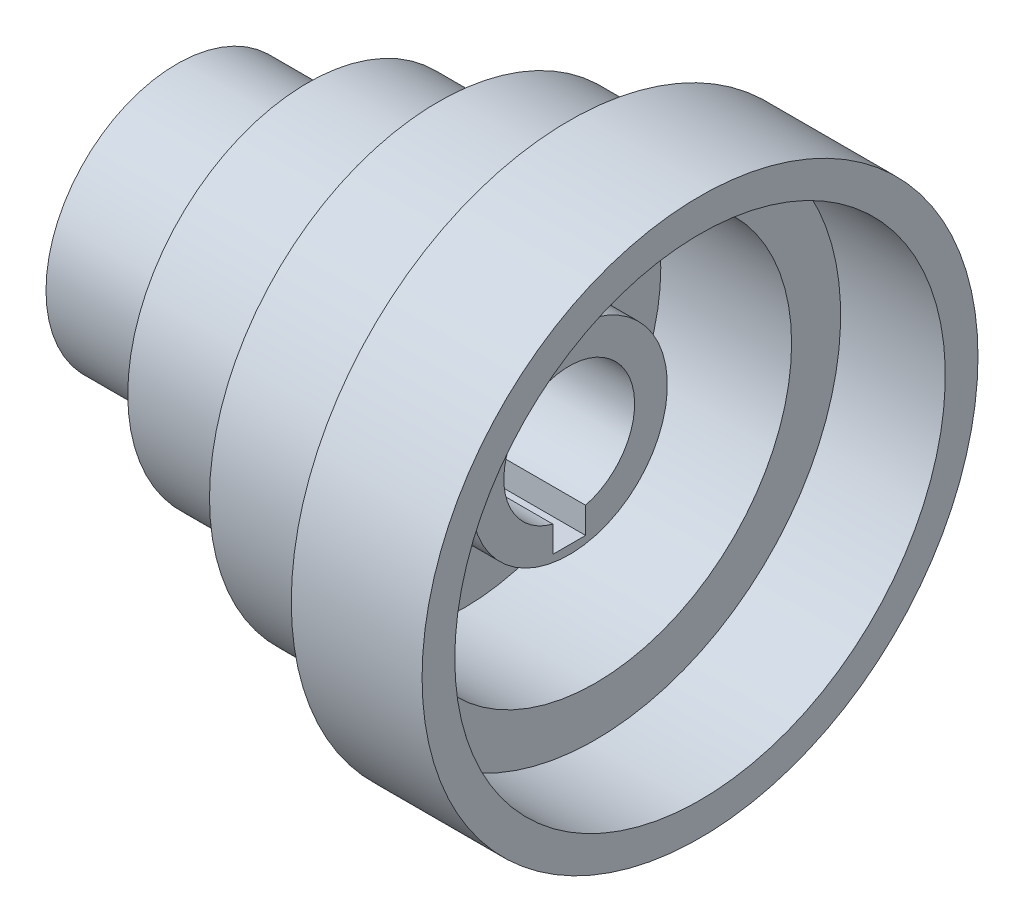
ISO-10303-21;
HEADER;
FILE_DESCRIPTION(('STEP AP214'),'2;1');
FILE_NAME('part.step','',(''),(''),'','','');
FILE_SCHEMA(('AUTOMOTIVE_DESIGN { 1 0 10303 214 1 1 1 1 }'));
ENDSEC;
DATA;
#1=APPLICATION_CONTEXT('core data for automotive mechanical design processes');
#2=APPLICATION_PROTOCOL_DEFINITION('international standard','automotive_design',2000,#1);
#3=PRODUCT_CONTEXT('',#1,'mechanical');
#4=PRODUCT('Part','Part','',(#3));
#5=PRODUCT_RELATED_PRODUCT_CATEGORY('part','',(#4));
#6=PRODUCT_DEFINITION_FORMATION('','',#4);
#7=PRODUCT_DEFINITION_CONTEXT('part definition',#1,'design');
#8=PRODUCT_DEFINITION('design','',#6,#7);
#9=PRODUCT_DEFINITION_SHAPE('','',#8);
#10=(LENGTH_UNIT() NAMED_UNIT(*) SI_UNIT(.MILLI.,.METRE.));
#11=(NAMED_UNIT(*) PLANE_ANGLE_UNIT() SI_UNIT($,.RADIAN.));
#12=(NAMED_UNIT(*) SI_UNIT($,.STERADIAN.) SOLID_ANGLE_UNIT());
#13=UNCERTAINTY_MEASURE_WITH_UNIT(LENGTH_MEASURE(1.E-05),#10,'distance_accuracy_value','');
#14=(GEOMETRIC_REPRESENTATION_CONTEXT(3) GLOBAL_UNCERTAINTY_ASSIGNED_CONTEXT((#13)) GLOBAL_UNIT_ASSIGNED_CONTEXT((#10,
#11,#12)) REPRESENTATION_CONTEXT('',''));
#15=CARTESIAN_POINT('',(0.,0.,0.));
#16=DIRECTION('',(0.,0.,1.));
#17=DIRECTION('',(1.,0.,0.));
#18=AXIS2_PLACEMENT_3D('',#15,#16,#17);
#19=CARTESIAN_POINT('',(-79.321922317314,0.,0.));
#20=DIRECTION('',(-1.,0.,0.));
#21=DIRECTION('',(0.,0.,1.));
#22=AXIS2_PLACEMENT_3D('',#19,#20,#21);
#23=CYLINDRICAL_SURFACE('',#22,20.);
#24=DIRECTION('',(-1.,0.,0.));
#25=VECTOR('',#24,1.);
#26=CARTESIAN_POINT('',(80.,-19.364916731037,5.));
#27=LINE('',#26,#25);
#28=CARTESIAN_POINT('',(40.,-19.364916731037,5.));
#29=VERTEX_POINT('',#28);
#30=CARTESIAN_POINT('',(-80.,-19.364916731037,5.));
#31=VERTEX_POINT('',#30);
#32=EDGE_CURVE('E75',#29,#31,#27,.T.);
#33=ORIENTED_EDGE('',*,*,#32,.T.);
#34=CARTESIAN_POINT('',(-80.,0.,0.));
#35=DIRECTION('',(-1.,0.,0.));
#36=DIRECTION('',(0.,0.,1.));
#37=AXIS2_PLACEMENT_3D('',#34,#35,#36);
#38=CIRCLE('',#37,20.);
#39=CARTESIAN_POINT('',(-80.,-19.364916731037,-4.99999999999999));
#40=VERTEX_POINT('',#39);
#41=EDGE_CURVE('E87',#31,#40,#38,.T.);
#42=ORIENTED_EDGE('',*,*,#41,.T.);
#43=DIRECTION('',(-1.,0.,0.));
#44=VECTOR('',#43,1.);
#45=CARTESIAN_POINT('',(80.,-19.364916731037,-4.99999999999999));
#46=LINE('',#45,#44);
#47=CARTESIAN_POINT('',(40.,-19.364916731037,-4.99999999999999));
#48=VERTEX_POINT('',#47);
#49=EDGE_CURVE('E90',#48,#40,#46,.T.);
#50=ORIENTED_EDGE('',*,*,#49,.F.);
#51=CARTESIAN_POINT('',(40.,0.,0.));
#52=DIRECTION('',(-1.,0.,0.));
#53=DIRECTION('',(0.,0.,1.));
#54=AXIS2_PLACEMENT_3D('',#51,#52,#53);
#55=CIRCLE('',#54,20.);
#56=EDGE_CURVE('E89',#29,#48,#55,.T.);
#57=ORIENTED_EDGE('',*,*,#56,.F.);
#58=EDGE_LOOP('',(#33,#42,#50,#57));
#59=FACE_BOUND('',#58,.T.);
#60=ADVANCED_FACE('F36',(#59),#23,.F.);
#61=CARTESIAN_POINT('',(-80.,20.,0.));
#62=DIRECTION('',(1.,0.,0.));
#63=DIRECTION('',(0.,0.,-1.));
#64=AXIS2_PLACEMENT_3D('',#61,#62,#63);
#65=PLANE('',#64);
#66=CARTESIAN_POINT('',(-80.,0.,0.));
#67=DIRECTION('',(-1.,0.,0.));
#68=DIRECTION('',(0.,0.,1.));
#69=AXIS2_PLACEMENT_3D('',#66,#67,#68);
#70=CIRCLE('',#69,40.);
#71=CARTESIAN_POINT('',(-80.,0.,40.));
#72=VERTEX_POINT('',#71);
#73=EDGE_CURVE('E96',#72,#72,#70,.T.);
#74=ORIENTED_EDGE('',*,*,#73,.T.);
#75=EDGE_LOOP('',(#74));
#76=FACE_BOUND('',#75,.T.);
#77=DIRECTION('',(0.,-1.,0.));
#78=VECTOR('',#77,1.);
#79=CARTESIAN_POINT('',(-80.,0.,4.99999999999998));
#80=LINE('',#79,#78);
#81=CARTESIAN_POINT('',(-80.,-27.364916731037,5.00000000000001));
#82=VERTEX_POINT('',#81);
#83=EDGE_CURVE('E72',#31,#82,#80,.T.);
#84=ORIENTED_EDGE('',*,*,#83,.T.);
#85=DIRECTION('',(0.,0.,1.));
#86=VECTOR('',#85,1.);
#87=CARTESIAN_POINT('',(-80.,-27.364916731037,0.));
#88=LINE('',#87,#86);
#89=CARTESIAN_POINT('',(-80.,-27.364916731037,-4.99999999999999));
#90=VERTEX_POINT('',#89);
#91=EDGE_CURVE('E91',#90,#82,#88,.T.);
#92=ORIENTED_EDGE('',*,*,#91,.F.);
#93=DIRECTION('',(0.,-1.,0.));
#94=VECTOR('',#93,1.);
#95=CARTESIAN_POINT('',(-80.,0.,-4.99999999999999));
#96=LINE('',#95,#94);
#97=EDGE_CURVE('E81',#40,#90,#96,.T.);
#98=ORIENTED_EDGE('',*,*,#97,.F.);
#99=ORIENTED_EDGE('',*,*,#41,.F.);
#100=EDGE_LOOP('',(#84,#92,#98,#99));
#101=FACE_BOUND('',#100,.T.);
#102=ADVANCED_FACE('F94',(#76,#101),#65,.F.);
#103=CARTESIAN_POINT('',(40.,30.,0.));
#104=DIRECTION('',(-1.,0.,0.));
#105=DIRECTION('',(0.,0.,1.));
#106=AXIS2_PLACEMENT_3D('',#103,#104,#105);
#107=PLANE('',#106);
#108=CARTESIAN_POINT('',(40.,0.,0.));
#109=DIRECTION('',(-1.,0.,0.));
#110=DIRECTION('',(0.,0.,1.));
#111=AXIS2_PLACEMENT_3D('',#108,#109,#110);
#112=CIRCLE('',#111,30.);
#113=CARTESIAN_POINT('',(40.,0.,30.));
#114=VERTEX_POINT('',#113);
#115=EDGE_CURVE('E110',#114,#114,#112,.T.);
#116=ORIENTED_EDGE('',*,*,#115,.F.);
#117=EDGE_LOOP('',(#116));
#118=FACE_BOUND('',#117,.T.);
#119=DIRECTION('',(0.,-1.,0.));
#120=VECTOR('',#119,1.);
#121=CARTESIAN_POINT('',(40.,30.,4.99999999999994));
#122=LINE('',#121,#120);
#123=CARTESIAN_POINT('',(40.,-27.364916731037,5.00000000000001));
#124=VERTEX_POINT('',#123);
#125=EDGE_CURVE('E11',#29,#124,#122,.T.);
#126=ORIENTED_EDGE('',*,*,#125,.F.);
#127=ORIENTED_EDGE('',*,*,#56,.T.);
#128=DIRECTION('',(0.,-1.,0.));
#129=VECTOR('',#128,1.);
#130=CARTESIAN_POINT('',(40.,30.,-4.99999999999999));
#131=LINE('',#130,#129);
#132=CARTESIAN_POINT('',(40.,-27.364916731037,-4.99999999999999));
#133=VERTEX_POINT('',#132);
#134=EDGE_CURVE('E95',#48,#133,#131,.T.);
#135=ORIENTED_EDGE('',*,*,#134,.T.);
#136=DIRECTION('',(0.,0.,1.));
#137=VECTOR('',#136,1.);
#138=CARTESIAN_POINT('',(40.,-27.364916731037,0.));
#139=LINE('',#138,#137);
#140=EDGE_CURVE('E43',#133,#124,#139,.T.);
#141=ORIENTED_EDGE('',*,*,#140,.T.);
#142=EDGE_LOOP('',(#126,#127,#135,#141));
#143=FACE_BOUND('',#142,.T.);
#144=ADVANCED_FACE('F106',(#118,#143),#107,.F.);
#145=CARTESIAN_POINT('',(-79.321922317314,0.,0.));
#146=DIRECTION('',(-1.,0.,0.));
#147=DIRECTION('',(0.,0.,1.));
#148=AXIS2_PLACEMENT_3D('',#145,#146,#147);
#149=CYLINDRICAL_SURFACE('',#148,40.);
#150=ORIENTED_EDGE('',*,*,#73,.F.);
#151=EDGE_LOOP('',(#150));
#152=FACE_BOUND('',#151,.T.);
#153=CARTESIAN_POINT('',(-40.,0.,0.));
#154=DIRECTION('',(-1.,0.,0.));
#155=DIRECTION('',(0.,0.,1.));
#156=AXIS2_PLACEMENT_3D('',#153,#154,#155);
#157=CIRCLE('',#156,40.);
#158=CARTESIAN_POINT('',(-40.,0.,40.));
#159=VERTEX_POINT('',#158);
#160=EDGE_CURVE('E101',#159,#159,#157,.T.);
#161=ORIENTED_EDGE('',*,*,#160,.T.);
#162=EDGE_LOOP('',(#161));
#163=FACE_BOUND('',#162,.T.);
#164=ADVANCED_FACE('F160',(#152,#163),#149,.T.);
#165=CARTESIAN_POINT('',(-40.,40.,0.));
#166=DIRECTION('',(1.,0.,0.));
#167=DIRECTION('',(0.,0.,-1.));
#168=AXIS2_PLACEMENT_3D('',#165,#166,#167);
#169=PLANE('',#168);
#170=ORIENTED_EDGE('',*,*,#160,.F.);
#171=EDGE_LOOP('',(#170));
#172=FACE_BOUND('',#171,.T.);
#173=CARTESIAN_POINT('',(-40.,0.,0.));
#174=DIRECTION('',(-1.,0.,0.));
#175=DIRECTION('',(0.,0.,1.));
#176=AXIS2_PLACEMENT_3D('',#173,#174,#175);
#177=CIRCLE('',#176,55.);
#178=CARTESIAN_POINT('',(-40.,0.,55.));
#179=VERTEX_POINT('',#178);
#180=EDGE_CURVE('E155',#179,#179,#177,.T.);
#181=ORIENTED_EDGE('',*,*,#180,.T.);
#182=EDGE_LOOP('',(#181));
#183=FACE_BOUND('',#182,.T.);
#184=ADVANCED_FACE('F162',(#172,#183),#169,.F.);
#185=CARTESIAN_POINT('',(-79.321922317314,0.,0.));
#186=DIRECTION('',(-1.,0.,0.));
#187=DIRECTION('',(0.,0.,1.));
#188=AXIS2_PLACEMENT_3D('',#185,#186,#187);
#189=CYLINDRICAL_SURFACE('',#188,55.);
#190=ORIENTED_EDGE('',*,*,#180,.F.);
#191=EDGE_LOOP('',(#190));
#192=FACE_BOUND('',#191,.T.);
#193=CARTESIAN_POINT('',(0.,0.,0.));
#194=DIRECTION('',(-1.,0.,0.));
#195=DIRECTION('',(0.,0.,1.));
#196=AXIS2_PLACEMENT_3D('',#193,#194,#195);
#197=CIRCLE('',#196,55.);
#198=CARTESIAN_POINT('',(0.,0.,55.));
#199=VERTEX_POINT('',#198);
#200=EDGE_CURVE('E152',#199,#199,#197,.T.);
#201=ORIENTED_EDGE('',*,*,#200,.T.);
#202=EDGE_LOOP('',(#201));
#203=FACE_BOUND('',#202,.T.);
#204=ADVANCED_FACE('F165',(#192,#203),#189,.T.);
#205=CARTESIAN_POINT('',(0.,55.,0.));
#206=DIRECTION('',(1.,0.,0.));
#207=DIRECTION('',(0.,0.,-1.));
#208=AXIS2_PLACEMENT_3D('',#205,#206,#207);
#209=PLANE('',#208);
#210=ORIENTED_EDGE('',*,*,#200,.F.);
#211=EDGE_LOOP('',(#210));
#212=FACE_BOUND('',#211,.T.);
#213=CARTESIAN_POINT('',(0.,0.,0.));
#214=DIRECTION('',(-1.,0.,0.));
#215=DIRECTION('',(0.,0.,1.));
#216=AXIS2_PLACEMENT_3D('',#213,#214,#215);
#217=CIRCLE('',#216,70.);
#218=CARTESIAN_POINT('',(0.,0.,70.));
#219=VERTEX_POINT('',#218);
#220=EDGE_CURVE('E149',#219,#219,#217,.T.);
#221=ORIENTED_EDGE('',*,*,#220,.T.);
#222=EDGE_LOOP('',(#221));
#223=FACE_BOUND('',#222,.T.);
#224=ADVANCED_FACE('F171',(#212,#223),#209,.F.);
#225=CARTESIAN_POINT('',(-79.321922317314,0.,0.));
#226=DIRECTION('',(-1.,0.,0.));
#227=DIRECTION('',(0.,0.,1.));
#228=AXIS2_PLACEMENT_3D('',#225,#226,#227);
#229=CYLINDRICAL_SURFACE('',#228,70.);
#230=ORIENTED_EDGE('',*,*,#220,.F.);
#231=EDGE_LOOP('',(#230));
#232=FACE_BOUND('',#231,.T.);
#233=CARTESIAN_POINT('',(40.,0.,0.));
#234=DIRECTION('',(-1.,0.,0.));
#235=DIRECTION('',(0.,0.,1.));
#236=AXIS2_PLACEMENT_3D('',#233,#234,#235);
#237=CIRCLE('',#236,70.);
#238=CARTESIAN_POINT('',(40.,0.,70.));
#239=VERTEX_POINT('',#238);
#240=EDGE_CURVE('E146',#239,#239,#237,.T.);
#241=ORIENTED_EDGE('',*,*,#240,.T.);
#242=EDGE_LOOP('',(#241));
#243=FACE_BOUND('',#242,.T.);
#244=ADVANCED_FACE('F177',(#232,#243),#229,.T.);
#245=CARTESIAN_POINT('',(40.,70.,0.));
#246=DIRECTION('',(1.,0.,0.));
#247=DIRECTION('',(0.,0.,-1.));
#248=AXIS2_PLACEMENT_3D('',#245,#246,#247);
#249=PLANE('',#248);
#250=ORIENTED_EDGE('',*,*,#240,.F.);
#251=EDGE_LOOP('',(#250));
#252=FACE_BOUND('',#251,.T.);
#253=CARTESIAN_POINT('',(40.,0.,0.));
#254=DIRECTION('',(-1.,0.,0.));
#255=DIRECTION('',(0.,0.,1.));
#256=AXIS2_PLACEMENT_3D('',#253,#254,#255);
#257=CIRCLE('',#256,85.);
#258=CARTESIAN_POINT('',(40.,0.,85.));
#259=VERTEX_POINT('',#258);
#260=EDGE_CURVE('E143',#259,#259,#257,.T.);
#261=ORIENTED_EDGE('',*,*,#260,.T.);
#262=EDGE_LOOP('',(#261));
#263=FACE_BOUND('',#262,.T.);
#264=ADVANCED_FACE('F183',(#252,#263),#249,.F.);
#265=CARTESIAN_POINT('',(-79.321922317314,0.,0.));
#266=DIRECTION('',(-1.,0.,0.));
#267=DIRECTION('',(0.,0.,1.));
#268=AXIS2_PLACEMENT_3D('',#265,#266,#267);
#269=CYLINDRICAL_SURFACE('',#268,85.);
#270=ORIENTED_EDGE('',*,*,#260,.F.);
#271=EDGE_LOOP('',(#270));
#272=FACE_BOUND('',#271,.T.);
#273=CARTESIAN_POINT('',(80.,0.,0.));
#274=DIRECTION('',(-1.,0.,0.));
#275=DIRECTION('',(0.,0.,1.));
#276=AXIS2_PLACEMENT_3D('',#273,#274,#275);
#277=CIRCLE('',#276,85.);
#278=CARTESIAN_POINT('',(80.,0.,85.));
#279=VERTEX_POINT('',#278);
#280=EDGE_CURVE('E140',#279,#279,#277,.T.);
#281=ORIENTED_EDGE('',*,*,#280,.T.);
#282=EDGE_LOOP('',(#281));
#283=FACE_BOUND('',#282,.T.);
#284=ADVANCED_FACE('F189',(#272,#283),#269,.T.);
#285=CARTESIAN_POINT('',(80.,85.,0.));
#286=DIRECTION('',(-1.,0.,0.));
#287=DIRECTION('',(0.,0.,1.));
#288=AXIS2_PLACEMENT_3D('',#285,#286,#287);
#289=PLANE('',#288);
#290=ORIENTED_EDGE('',*,*,#280,.F.);
#291=EDGE_LOOP('',(#290));
#292=FACE_BOUND('',#291,.T.);
#293=CARTESIAN_POINT('',(80.,0.,0.));
#294=DIRECTION('',(-1.,0.,0.));
#295=DIRECTION('',(0.,0.,1.));
#296=AXIS2_PLACEMENT_3D('',#293,#294,#295);
#297=CIRCLE('',#296,75.);
#298=CARTESIAN_POINT('',(80.,0.,75.));
#299=VERTEX_POINT('',#298);
#300=EDGE_CURVE('E137',#299,#299,#297,.T.);
#301=ORIENTED_EDGE('',*,*,#300,.T.);
#302=EDGE_LOOP('',(#301));
#303=FACE_BOUND('',#302,.T.);
#304=ADVANCED_FACE('F195',(#292,#303),#289,.F.);
#305=CARTESIAN_POINT('',(-79.321922317314,0.,0.));
#306=DIRECTION('',(-1.,0.,0.));
#307=DIRECTION('',(0.,0.,1.));
#308=AXIS2_PLACEMENT_3D('',#305,#306,#307);
#309=CYLINDRICAL_SURFACE('',#308,75.);
#310=ORIENTED_EDGE('',*,*,#300,.F.);
#311=EDGE_LOOP('',(#310));
#312=FACE_BOUND('',#311,.T.);
#313=CARTESIAN_POINT('',(48.,0.,0.));
#314=DIRECTION('',(-1.,0.,0.));
#315=DIRECTION('',(0.,0.,1.));
#316=AXIS2_PLACEMENT_3D('',#313,#314,#315);
#317=CIRCLE('',#316,75.);
#318=CARTESIAN_POINT('',(48.,0.,75.));
#319=VERTEX_POINT('',#318);
#320=EDGE_CURVE('E134',#319,#319,#317,.T.);
#321=ORIENTED_EDGE('',*,*,#320,.T.);
#322=EDGE_LOOP('',(#321));
#323=FACE_BOUND('',#322,.T.);
#324=ADVANCED_FACE('F201',(#312,#323),#309,.F.);
#325=CARTESIAN_POINT('',(48.,75.,0.));
#326=DIRECTION('',(-1.,0.,0.));
#327=DIRECTION('',(0.,0.,1.));
#328=AXIS2_PLACEMENT_3D('',#325,#326,#327);
#329=PLANE('',#328);
#330=ORIENTED_EDGE('',*,*,#320,.F.);
#331=EDGE_LOOP('',(#330));
#332=FACE_BOUND('',#331,.T.);
#333=CARTESIAN_POINT('',(48.,0.,0.));
#334=DIRECTION('',(-1.,0.,0.));
#335=DIRECTION('',(0.,0.,1.));
#336=AXIS2_PLACEMENT_3D('',#333,#334,#335);
#337=CIRCLE('',#336,60.);
#338=CARTESIAN_POINT('',(48.,0.,60.));
#339=VERTEX_POINT('',#338);
#340=EDGE_CURVE('E131',#339,#339,#337,.T.);
#341=ORIENTED_EDGE('',*,*,#340,.T.);
#342=EDGE_LOOP('',(#341));
#343=FACE_BOUND('',#342,.T.);
#344=ADVANCED_FACE('F207',(#332,#343),#329,.F.);
#345=CARTESIAN_POINT('',(-79.321922317314,0.,0.));
#346=DIRECTION('',(-1.,0.,0.));
#347=DIRECTION('',(0.,0.,1.));
#348=AXIS2_PLACEMENT_3D('',#345,#346,#347);
#349=CYLINDRICAL_SURFACE('',#348,60.);
#350=ORIENTED_EDGE('',*,*,#340,.F.);
#351=EDGE_LOOP('',(#350));
#352=FACE_BOUND('',#351,.T.);
#353=CARTESIAN_POINT('',(7.99999999999999,0.,0.));
#354=DIRECTION('',(-1.,0.,0.));
#355=DIRECTION('',(0.,0.,1.));
#356=AXIS2_PLACEMENT_3D('',#353,#354,#355);
#357=CIRCLE('',#356,60.);
#358=CARTESIAN_POINT('',(7.99999999999999,0.,60.));
#359=VERTEX_POINT('',#358);
#360=EDGE_CURVE('E128',#359,#359,#357,.T.);
#361=ORIENTED_EDGE('',*,*,#360,.T.);
#362=EDGE_LOOP('',(#361));
#363=FACE_BOUND('',#362,.T.);
#364=ADVANCED_FACE('F213',(#352,#363),#349,.F.);
#365=CARTESIAN_POINT('',(8.,60.,0.));
#366=DIRECTION('',(-1.,0.,0.));
#367=DIRECTION('',(0.,0.,1.));
#368=AXIS2_PLACEMENT_3D('',#365,#366,#367);
#369=PLANE('',#368);
#370=ORIENTED_EDGE('',*,*,#360,.F.);
#371=EDGE_LOOP('',(#370));
#372=FACE_BOUND('',#371,.T.);
#373=CARTESIAN_POINT('',(7.99999999999999,0.,0.));
#374=DIRECTION('',(-1.,0.,0.));
#375=DIRECTION('',(0.,0.,1.));
#376=AXIS2_PLACEMENT_3D('',#373,#374,#375);
#377=CIRCLE('',#376,45.);
#378=CARTESIAN_POINT('',(7.99999999999999,0.,45.));
#379=VERTEX_POINT('',#378);
#380=EDGE_CURVE('E125',#379,#379,#377,.T.);
#381=ORIENTED_EDGE('',*,*,#380,.T.);
#382=EDGE_LOOP('',(#381));
#383=FACE_BOUND('',#382,.T.);
#384=ADVANCED_FACE('F219',(#372,#383),#369,.F.);
#385=CARTESIAN_POINT('',(-79.321922317314,0.,0.));
#386=DIRECTION('',(-1.,0.,0.));
#387=DIRECTION('',(0.,0.,1.));
#388=AXIS2_PLACEMENT_3D('',#385,#386,#387);
#389=CYLINDRICAL_SURFACE('',#388,45.);
#390=ORIENTED_EDGE('',*,*,#380,.F.);
#391=EDGE_LOOP('',(#390));
#392=FACE_BOUND('',#391,.T.);
#393=CARTESIAN_POINT('',(-32.,0.,0.));
#394=DIRECTION('',(-1.,0.,0.));
#395=DIRECTION('',(0.,0.,1.));
#396=AXIS2_PLACEMENT_3D('',#393,#394,#395);
#397=CIRCLE('',#396,45.);
#398=CARTESIAN_POINT('',(-32.,0.,45.));
#399=VERTEX_POINT('',#398);
#400=EDGE_CURVE('E122',#399,#399,#397,.T.);
#401=ORIENTED_EDGE('',*,*,#400,.T.);
#402=EDGE_LOOP('',(#401));
#403=FACE_BOUND('',#402,.T.);
#404=ADVANCED_FACE('F225',(#392,#403),#389,.F.);
#405=CARTESIAN_POINT('',(-32.,45.,0.));
#406=DIRECTION('',(-1.,0.,0.));
#407=DIRECTION('',(0.,0.,1.));
#408=AXIS2_PLACEMENT_3D('',#405,#406,#407);
#409=PLANE('',#408);
#410=ORIENTED_EDGE('',*,*,#400,.F.);
#411=EDGE_LOOP('',(#410));
#412=FACE_BOUND('',#411,.T.);
#413=CARTESIAN_POINT('',(-32.,0.,0.));
#414=DIRECTION('',(-1.,0.,0.));
#415=DIRECTION('',(0.,0.,1.));
#416=AXIS2_PLACEMENT_3D('',#413,#414,#415);
#417=CIRCLE('',#416,30.);
#418=CARTESIAN_POINT('',(-32.,0.,30.));
#419=VERTEX_POINT('',#418);
#420=EDGE_CURVE('E119',#419,#419,#417,.T.);
#421=ORIENTED_EDGE('',*,*,#420,.T.);
#422=EDGE_LOOP('',(#421));
#423=FACE_BOUND('',#422,.T.);
#424=ADVANCED_FACE('F231',(#412,#423),#409,.F.);
#425=CARTESIAN_POINT('',(-79.321922317314,0.,0.));
#426=DIRECTION('',(-1.,0.,0.));
#427=DIRECTION('',(0.,0.,1.));
#428=AXIS2_PLACEMENT_3D('',#425,#426,#427);
#429=CYLINDRICAL_SURFACE('',#428,30.);
#430=ORIENTED_EDGE('',*,*,#420,.F.);
#431=EDGE_LOOP('',(#430));
#432=FACE_BOUND('',#431,.T.);
#433=ORIENTED_EDGE('',*,*,#115,.T.);
#434=EDGE_LOOP('',(#433));
#435=FACE_BOUND('',#434,.T.);
#436=ADVANCED_FACE('F237',(#432,#435),#429,.T.);
#437=CARTESIAN_POINT('',(80.,0.,4.99999999999998));
#438=DIRECTION('',(0.,0.,-1.));
#439=DIRECTION('',(0.,1.,0.));
#440=AXIS2_PLACEMENT_3D('',#437,#438,#439);
#441=PLANE('',#440);
#442=ORIENTED_EDGE('',*,*,#125,.T.);
#443=DIRECTION('',(-1.,0.,0.));
#444=VECTOR('',#443,1.);
#445=CARTESIAN_POINT('',(80.,-27.364916731037,5.00000000000001));
#446=LINE('',#445,#444);
#447=EDGE_CURVE('E76',#124,#82,#446,.T.);
#448=ORIENTED_EDGE('',*,*,#447,.T.);
#449=ORIENTED_EDGE('',*,*,#83,.F.);
#450=ORIENTED_EDGE('',*,*,#32,.F.);
#451=EDGE_LOOP('',(#442,#448,#449,#450));
#452=FACE_BOUND('',#451,.T.);
#453=ADVANCED_FACE('F74',(#452),#441,.T.);
#454=CARTESIAN_POINT('',(80.,-27.364916731037,0.));
#455=DIRECTION('',(0.,-1.,0.));
#456=DIRECTION('',(0.,0.,-1.));
#457=AXIS2_PLACEMENT_3D('',#454,#455,#456);
#458=PLANE('',#457);
#459=DIRECTION('',(-1.,0.,0.));
#460=VECTOR('',#459,1.);
#461=CARTESIAN_POINT('',(80.,-27.364916731037,-4.99999999999999));
#462=LINE('',#461,#460);
#463=EDGE_CURVE('E50',#133,#90,#462,.T.);
#464=ORIENTED_EDGE('',*,*,#463,.T.);
#465=ORIENTED_EDGE('',*,*,#91,.T.);
#466=ORIENTED_EDGE('',*,*,#447,.F.);
#467=ORIENTED_EDGE('',*,*,#140,.F.);
#468=EDGE_LOOP('',(#464,#465,#466,#467));
#469=FACE_BOUND('',#468,.T.);
#470=ADVANCED_FACE('F108',(#469),#458,.F.);
#471=CARTESIAN_POINT('',(80.,0.,-4.99999999999999));
#472=DIRECTION('',(0.,0.,-1.));
#473=DIRECTION('',(-1.,0.,0.));
#474=AXIS2_PLACEMENT_3D('',#471,#472,#473);
#475=PLANE('',#474);
#476=ORIENTED_EDGE('',*,*,#49,.T.);
#477=ORIENTED_EDGE('',*,*,#97,.T.);
#478=ORIENTED_EDGE('',*,*,#463,.F.);
#479=ORIENTED_EDGE('',*,*,#134,.F.);
#480=EDGE_LOOP('',(#476,#477,#478,#479));
#481=FACE_BOUND('',#480,.T.);
#482=ADVANCED_FACE('F287',(#481),#475,.F.);
#483=CLOSED_SHELL('',(#60,#102,#144,#164,#184,#204,#224,#244,#264,#284,#304,#324,#344,#364,#384,
#404,#424,#436,#453,#470,#482));
#484=MANIFOLD_SOLID_BREP('B2',#483);
#485=ADVANCED_BREP_SHAPE_REPRESENTATION('',(#18,#484),#14);
#486=SHAPE_DEFINITION_REPRESENTATION(#9,#485);
ENDSEC;
END-ISO-10303-21;
